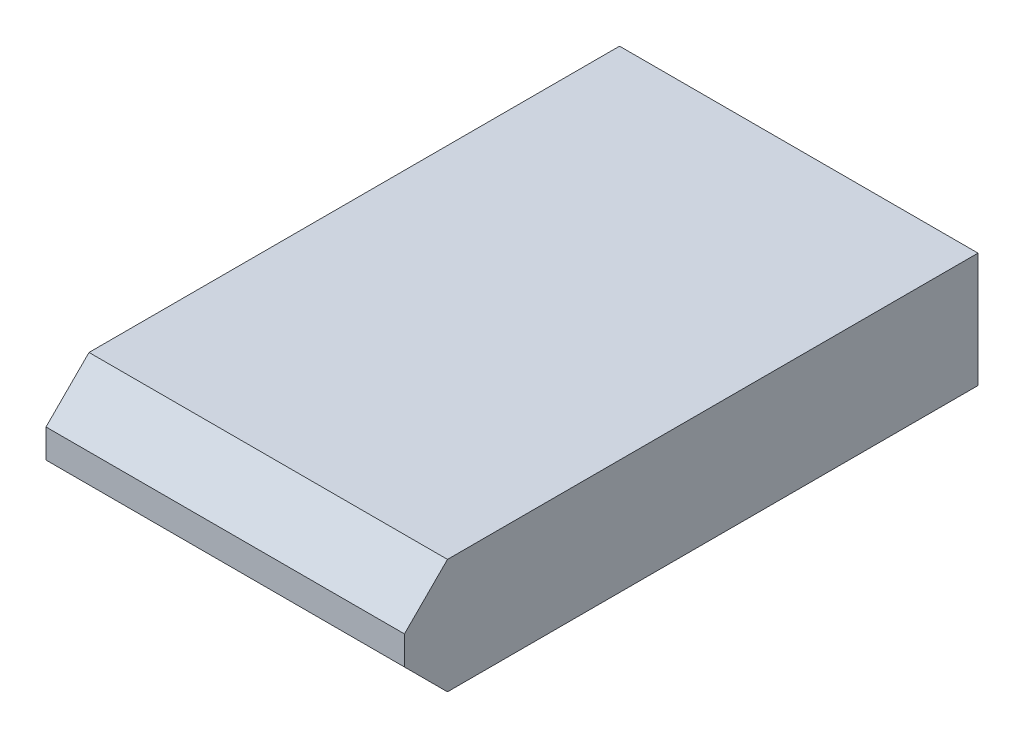
ISO-10303-21;
HEADER;
FILE_DESCRIPTION(('STEP AP214'),'2;1');
FILE_NAME('part.step','',(''),(''),'','','');
FILE_SCHEMA(('AUTOMOTIVE_DESIGN { 1 0 10303 214 1 1 1 1 }'));
ENDSEC;
DATA;
#1=APPLICATION_CONTEXT('core data for automotive mechanical design processes');
#2=APPLICATION_PROTOCOL_DEFINITION('international standard','automotive_design',2000,#1);
#3=PRODUCT_CONTEXT('',#1,'mechanical');
#4=PRODUCT('Part','Part','',(#3));
#5=PRODUCT_RELATED_PRODUCT_CATEGORY('part','',(#4));
#6=PRODUCT_DEFINITION_FORMATION('','',#4);
#7=PRODUCT_DEFINITION_CONTEXT('part definition',#1,'design');
#8=PRODUCT_DEFINITION('design','',#6,#7);
#9=PRODUCT_DEFINITION_SHAPE('','',#8);
#10=(LENGTH_UNIT() NAMED_UNIT(*) SI_UNIT(.MILLI.,.METRE.));
#11=(NAMED_UNIT(*) PLANE_ANGLE_UNIT() SI_UNIT($,.RADIAN.));
#12=(NAMED_UNIT(*) SI_UNIT($,.STERADIAN.) SOLID_ANGLE_UNIT());
#13=UNCERTAINTY_MEASURE_WITH_UNIT(LENGTH_MEASURE(1.E-05),#10,'distance_accuracy_value','');
#14=(GEOMETRIC_REPRESENTATION_CONTEXT(3) GLOBAL_UNCERTAINTY_ASSIGNED_CONTEXT((#13)) GLOBAL_UNIT_ASSIGNED_CONTEXT((#10,
#11,#12)) REPRESENTATION_CONTEXT('',''));
#15=CARTESIAN_POINT('',(0.,0.,0.));
#16=DIRECTION('',(0.,0.,1.));
#17=DIRECTION('',(1.,0.,0.));
#18=AXIS2_PLACEMENT_3D('',#15,#16,#17);
#19=CARTESIAN_POINT('',(0.,8.,0.));
#20=DIRECTION('',(1.,0.,0.));
#21=DIRECTION('',(0.,0.,-1.));
#22=AXIS2_PLACEMENT_3D('',#19,#20,#21);
#23=PLANE('',#22);
#24=DIRECTION('',(0.,0.,1.));
#25=VECTOR('',#24,1.);
#26=CARTESIAN_POINT('',(0.,0.,0.));
#27=LINE('',#26,#25);
#28=CARTESIAN_POINT('',(0.,0.,-40.));
#29=VERTEX_POINT('',#28);
#30=CARTESIAN_POINT('',(0.,0.,-3.00000000000002));
#31=VERTEX_POINT('',#30);
#32=EDGE_CURVE('E132',#29,#31,#27,.T.);
#33=ORIENTED_EDGE('',*,*,#32,.T.);
#34=DIRECTION('',(0.,0.707106781186547,0.707106781186548));
#35=VECTOR('',#34,1.);
#36=CARTESIAN_POINT('',(0.,3.00000000000001,0.));
#37=LINE('',#36,#35);
#38=CARTESIAN_POINT('',(0.,3.00000000000001,0.));
#39=VERTEX_POINT('',#38);
#40=EDGE_CURVE('E54',#31,#39,#37,.T.);
#41=ORIENTED_EDGE('',*,*,#40,.T.);
#42=DIRECTION('',(0.,-1.,0.));
#43=VECTOR('',#42,1.);
#44=CARTESIAN_POINT('',(0.,8.,0.));
#45=LINE('',#44,#43);
#46=CARTESIAN_POINT('',(0.,4.99999999999999,0.));
#47=VERTEX_POINT('',#46);
#48=EDGE_CURVE('E142',#47,#39,#45,.T.);
#49=ORIENTED_EDGE('',*,*,#48,.F.);
#50=DIRECTION('',(0.,-0.707106781186548,0.707106781186547));
#51=VECTOR('',#50,1.);
#52=CARTESIAN_POINT('',(0.,8.,-3.));
#53=LINE('',#52,#51);
#54=CARTESIAN_POINT('',(0.,8.,-3.));
#55=VERTEX_POINT('',#54);
#56=EDGE_CURVE('E61',#47,#55,#53,.F.);
#57=ORIENTED_EDGE('',*,*,#56,.T.);
#58=DIRECTION('',(0.,0.,1.));
#59=VECTOR('',#58,1.);
#60=CARTESIAN_POINT('',(0.,8.,0.));
#61=LINE('',#60,#59);
#62=CARTESIAN_POINT('',(0.,8.,-40.));
#63=VERTEX_POINT('',#62);
#64=EDGE_CURVE('E111',#63,#55,#61,.T.);
#65=ORIENTED_EDGE('',*,*,#64,.F.);
#66=DIRECTION('',(0.,-1.,0.));
#67=VECTOR('',#66,1.);
#68=CARTESIAN_POINT('',(0.,8.,-40.));
#69=LINE('',#68,#67);
#70=EDGE_CURVE('E122',#63,#29,#69,.T.);
#71=ORIENTED_EDGE('',*,*,#70,.T.);
#72=EDGE_LOOP('',(#33,#41,#49,#57,#65,#71));
#73=FACE_BOUND('',#72,.T.);
#74=ADVANCED_FACE('F44',(#73),#23,.F.);
#75=CARTESIAN_POINT('',(0.,8.,0.));
#76=DIRECTION('',(0.,0.,-1.));
#77=DIRECTION('',(-1.,0.,0.));
#78=AXIS2_PLACEMENT_3D('',#75,#76,#77);
#79=PLANE('',#78);
#80=ORIENTED_EDGE('',*,*,#48,.T.);
#81=DIRECTION('',(1.,0.,0.));
#82=VECTOR('',#81,1.);
#83=CARTESIAN_POINT('',(25.,3.00000000000001,0.));
#84=LINE('',#83,#82);
#85=CARTESIAN_POINT('',(25.,3.00000000000001,0.));
#86=VERTEX_POINT('',#85);
#87=EDGE_CURVE('E149',#39,#86,#84,.T.);
#88=ORIENTED_EDGE('',*,*,#87,.T.);
#89=DIRECTION('',(0.,-1.,0.));
#90=VECTOR('',#89,1.);
#91=CARTESIAN_POINT('',(25.,8.,0.));
#92=LINE('',#91,#90);
#93=CARTESIAN_POINT('',(25.,4.99999999999999,0.));
#94=VERTEX_POINT('',#93);
#95=EDGE_CURVE('E121',#94,#86,#92,.T.);
#96=ORIENTED_EDGE('',*,*,#95,.F.);
#97=DIRECTION('',(-1.,0.,0.));
#98=VECTOR('',#97,1.);
#99=CARTESIAN_POINT('',(0.,4.99999999999999,0.));
#100=LINE('',#99,#98);
#101=EDGE_CURVE('E146',#94,#47,#100,.T.);
#102=ORIENTED_EDGE('',*,*,#101,.T.);
#103=EDGE_LOOP('',(#80,#88,#96,#102));
#104=FACE_BOUND('',#103,.T.);
#105=ADVANCED_FACE('F167',(#104),#79,.F.);
#106=CARTESIAN_POINT('',(25.,8.,0.));
#107=DIRECTION('',(-1.,0.,0.));
#108=DIRECTION('',(0.,0.,1.));
#109=AXIS2_PLACEMENT_3D('',#106,#107,#108);
#110=PLANE('',#109);
#111=ORIENTED_EDGE('',*,*,#95,.T.);
#112=DIRECTION('',(0.,-0.707106781186547,-0.707106781186548));
#113=VECTOR('',#112,1.);
#114=CARTESIAN_POINT('',(25.,3.00000000000001,0.));
#115=LINE('',#114,#113);
#116=CARTESIAN_POINT('',(25.,0.,-3.00000000000002));
#117=VERTEX_POINT('',#116);
#118=EDGE_CURVE('E156',#86,#117,#115,.T.);
#119=ORIENTED_EDGE('',*,*,#118,.T.);
#120=DIRECTION('',(0.,0.,-1.));
#121=VECTOR('',#120,1.);
#122=CARTESIAN_POINT('',(25.,0.,0.));
#123=LINE('',#122,#121);
#124=CARTESIAN_POINT('',(25.,0.,-40.));
#125=VERTEX_POINT('',#124);
#126=EDGE_CURVE('E117',#117,#125,#123,.T.);
#127=ORIENTED_EDGE('',*,*,#126,.T.);
#128=DIRECTION('',(0.,-1.,0.));
#129=VECTOR('',#128,1.);
#130=CARTESIAN_POINT('',(25.,8.,-40.));
#131=LINE('',#130,#129);
#132=CARTESIAN_POINT('',(25.,8.,-40.));
#133=VERTEX_POINT('',#132);
#134=EDGE_CURVE('E114',#133,#125,#131,.T.);
#135=ORIENTED_EDGE('',*,*,#134,.F.);
#136=DIRECTION('',(0.,0.,-1.));
#137=VECTOR('',#136,1.);
#138=CARTESIAN_POINT('',(25.,8.,0.));
#139=LINE('',#138,#137);
#140=CARTESIAN_POINT('',(25.,8.,-3.));
#141=VERTEX_POINT('',#140);
#142=EDGE_CURVE('E102',#141,#133,#139,.T.);
#143=ORIENTED_EDGE('',*,*,#142,.F.);
#144=DIRECTION('',(0.,0.707106781186548,-0.707106781186547));
#145=VECTOR('',#144,1.);
#146=CARTESIAN_POINT('',(25.,8.,-3.));
#147=LINE('',#146,#145);
#148=EDGE_CURVE('E153',#141,#94,#147,.F.);
#149=ORIENTED_EDGE('',*,*,#148,.T.);
#150=EDGE_LOOP('',(#111,#119,#127,#135,#143,#149));
#151=FACE_BOUND('',#150,.T.);
#152=ADVANCED_FACE('F116',(#151),#110,.F.);
#153=CARTESIAN_POINT('',(0.,8.,-40.));
#154=DIRECTION('',(0.,0.,1.));
#155=DIRECTION('',(1.,0.,0.));
#156=AXIS2_PLACEMENT_3D('',#153,#154,#155);
#157=PLANE('',#156);
#158=DIRECTION('',(-1.,0.,0.));
#159=VECTOR('',#158,1.);
#160=CARTESIAN_POINT('',(0.,0.,-40.));
#161=LINE('',#160,#159);
#162=EDGE_CURVE('E137',#125,#29,#161,.T.);
#163=ORIENTED_EDGE('',*,*,#162,.T.);
#164=ORIENTED_EDGE('',*,*,#70,.F.);
#165=DIRECTION('',(-1.,0.,0.));
#166=VECTOR('',#165,1.);
#167=CARTESIAN_POINT('',(0.,8.,-40.));
#168=LINE('',#167,#166);
#169=EDGE_CURVE('E106',#133,#63,#168,.T.);
#170=ORIENTED_EDGE('',*,*,#169,.F.);
#171=ORIENTED_EDGE('',*,*,#134,.T.);
#172=EDGE_LOOP('',(#163,#164,#170,#171));
#173=FACE_BOUND('',#172,.T.);
#174=ADVANCED_FACE('F124',(#173),#157,.F.);
#175=CARTESIAN_POINT('',(0.,8.,0.));
#176=DIRECTION('',(0.,-1.,0.));
#177=DIRECTION('',(0.,0.,-1.));
#178=AXIS2_PLACEMENT_3D('',#175,#176,#177);
#179=PLANE('',#178);
#180=ORIENTED_EDGE('',*,*,#64,.T.);
#181=DIRECTION('',(1.,0.,0.));
#182=VECTOR('',#181,1.);
#183=CARTESIAN_POINT('',(0.,8.,-3.));
#184=LINE('',#183,#182);
#185=EDGE_CURVE('E11',#55,#141,#184,.T.);
#186=ORIENTED_EDGE('',*,*,#185,.T.);
#187=ORIENTED_EDGE('',*,*,#142,.T.);
#188=ORIENTED_EDGE('',*,*,#169,.T.);
#189=EDGE_LOOP('',(#180,#186,#187,#188));
#190=FACE_BOUND('',#189,.T.);
#191=ADVANCED_FACE('F104',(#190),#179,.F.);
#192=CARTESIAN_POINT('',(0.,0.,0.));
#193=DIRECTION('',(0.,-1.,0.));
#194=DIRECTION('',(0.,0.,-1.));
#195=AXIS2_PLACEMENT_3D('',#192,#193,#194);
#196=PLANE('',#195);
#197=ORIENTED_EDGE('',*,*,#126,.F.);
#198=DIRECTION('',(-1.,0.,0.));
#199=VECTOR('',#198,1.);
#200=CARTESIAN_POINT('',(0.,0.,-3.00000000000002));
#201=LINE('',#200,#199);
#202=EDGE_CURVE('E69',#117,#31,#201,.T.);
#203=ORIENTED_EDGE('',*,*,#202,.T.);
#204=ORIENTED_EDGE('',*,*,#32,.F.);
#205=ORIENTED_EDGE('',*,*,#162,.F.);
#206=EDGE_LOOP('',(#197,#203,#204,#205));
#207=FACE_BOUND('',#206,.T.);
#208=ADVANCED_FACE('F171',(#207),#196,.T.);
#209=CARTESIAN_POINT('',(0.,3.00000000000001,0.));
#210=DIRECTION('',(0.,-0.707106781186548,0.707106781186547));
#211=DIRECTION('',(-1.,0.,0.));
#212=AXIS2_PLACEMENT_3D('',#209,#210,#211);
#213=PLANE('',#212);
#214=ORIENTED_EDGE('',*,*,#40,.F.);
#215=ORIENTED_EDGE('',*,*,#202,.F.);
#216=ORIENTED_EDGE('',*,*,#118,.F.);
#217=ORIENTED_EDGE('',*,*,#87,.F.);
#218=EDGE_LOOP('',(#214,#215,#216,#217));
#219=FACE_BOUND('',#218,.T.);
#220=ADVANCED_FACE('F170',(#219),#213,.T.);
#221=CARTESIAN_POINT('',(0.,8.,-3.));
#222=DIRECTION('',(0.,-0.707106781186547,-0.707106781186548));
#223=DIRECTION('',(1.,0.,0.));
#224=AXIS2_PLACEMENT_3D('',#221,#222,#223);
#225=PLANE('',#224);
#226=ORIENTED_EDGE('',*,*,#56,.F.);
#227=ORIENTED_EDGE('',*,*,#101,.F.);
#228=ORIENTED_EDGE('',*,*,#148,.F.);
#229=ORIENTED_EDGE('',*,*,#185,.F.);
#230=EDGE_LOOP('',(#226,#227,#228,#229));
#231=FACE_BOUND('',#230,.T.);
#232=ADVANCED_FACE('F47',(#231),#225,.F.);
#233=CLOSED_SHELL('',(#74,#105,#152,#174,#191,#208,#220,#232));
#234=MANIFOLD_SOLID_BREP('B2',#233);
#235=ADVANCED_BREP_SHAPE_REPRESENTATION('',(#18,#234),#14);
#236=SHAPE_DEFINITION_REPRESENTATION(#9,#235);
ENDSEC;
END-ISO-10303-21;
